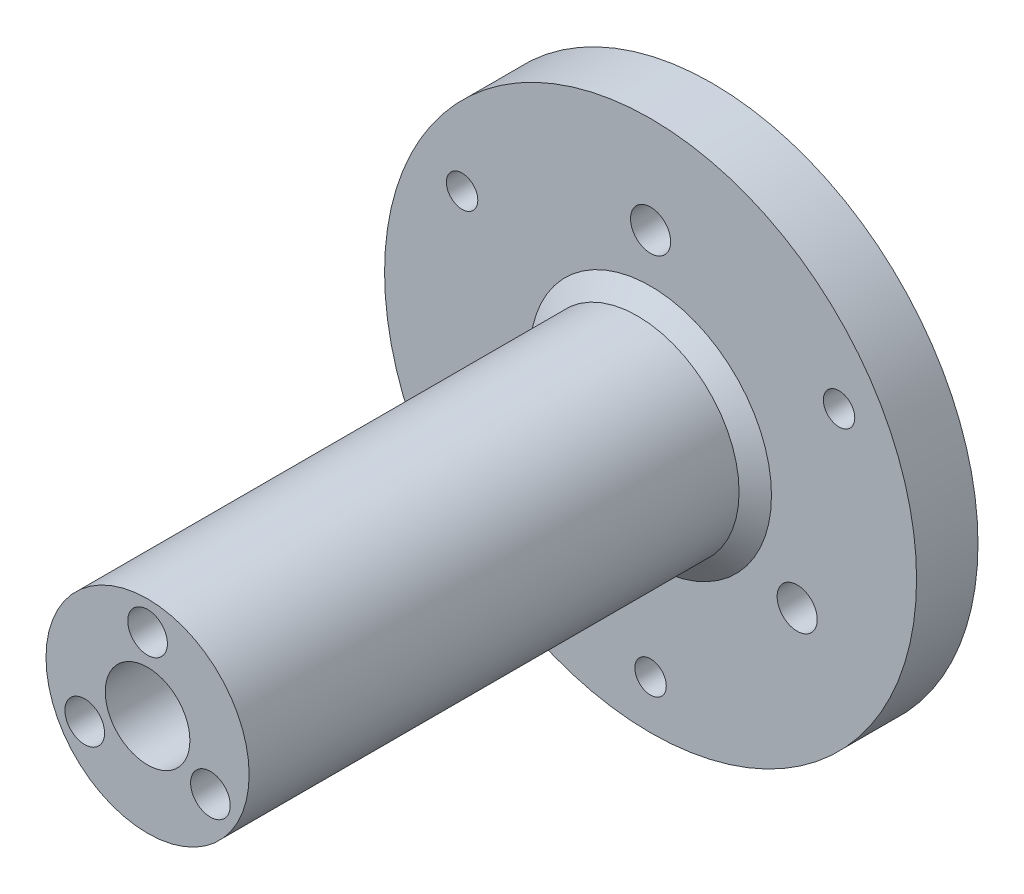
ISO-10303-21;
HEADER;
FILE_DESCRIPTION(('STEP AP214'),'2;1');
FILE_NAME('part.step','',(''),(''),'','','');
FILE_SCHEMA(('AUTOMOTIVE_DESIGN { 1 0 10303 214 1 1 1 1 }'));
ENDSEC;
DATA;
#1=APPLICATION_CONTEXT('core data for automotive mechanical design processes');
#2=APPLICATION_PROTOCOL_DEFINITION('international standard','automotive_design',2000,#1);
#3=PRODUCT_CONTEXT('',#1,'mechanical');
#4=PRODUCT('Part','Part','',(#3));
#5=PRODUCT_RELATED_PRODUCT_CATEGORY('part','',(#4));
#6=PRODUCT_DEFINITION_FORMATION('','',#4);
#7=PRODUCT_DEFINITION_CONTEXT('part definition',#1,'design');
#8=PRODUCT_DEFINITION('design','',#6,#7);
#9=PRODUCT_DEFINITION_SHAPE('','',#8);
#10=(LENGTH_UNIT() NAMED_UNIT(*) SI_UNIT(.MILLI.,.METRE.));
#11=(NAMED_UNIT(*) PLANE_ANGLE_UNIT() SI_UNIT($,.RADIAN.));
#12=(NAMED_UNIT(*) SI_UNIT($,.STERADIAN.) SOLID_ANGLE_UNIT());
#13=UNCERTAINTY_MEASURE_WITH_UNIT(LENGTH_MEASURE(1.E-05),#10,'distance_accuracy_value','');
#14=(GEOMETRIC_REPRESENTATION_CONTEXT(3) GLOBAL_UNCERTAINTY_ASSIGNED_CONTEXT((#13)) GLOBAL_UNIT_ASSIGNED_CONTEXT((#10,
#11,#12)) REPRESENTATION_CONTEXT('',''));
#15=CARTESIAN_POINT('',(0.,0.,0.));
#16=DIRECTION('',(0.,0.,1.));
#17=DIRECTION('',(1.,0.,0.));
#18=AXIS2_PLACEMENT_3D('',#15,#16,#17);
#19=CARTESIAN_POINT('',(0.,0.,6.35));
#20=DIRECTION('',(0.,0.,1.));
#21=DIRECTION('',(1.,0.,0.));
#22=AXIS2_PLACEMENT_3D('',#19,#20,#21);
#23=PLANE('',#22);
#24=CARTESIAN_POINT('',(-15.1554445662277,-8.75,6.35));
#25=DIRECTION('',(0.,0.,1.));
#26=DIRECTION('',(1.,0.,0.));
#27=AXIS2_PLACEMENT_3D('',#24,#25,#26);
#28=CIRCLE('',#27,2.075);
#29=CARTESIAN_POINT('',(-13.0804445662277,-8.75,6.35));
#30=VERTEX_POINT('',#29);
#31=EDGE_CURVE('E75',#30,#30,#28,.T.);
#32=ORIENTED_EDGE('',*,*,#31,.F.);
#33=EDGE_LOOP('',(#32));
#34=FACE_BOUND('',#33,.T.);
#35=CARTESIAN_POINT('',(15.1554445662277,-8.75,6.35));
#36=DIRECTION('',(0.,0.,1.));
#37=DIRECTION('',(1.,0.,0.));
#38=AXIS2_PLACEMENT_3D('',#35,#36,#37);
#39=CIRCLE('',#38,2.075);
#40=CARTESIAN_POINT('',(17.2304445662277,-8.75,6.35));
#41=VERTEX_POINT('',#40);
#42=EDGE_CURVE('E214',#41,#41,#39,.T.);
#43=ORIENTED_EDGE('',*,*,#42,.F.);
#44=EDGE_LOOP('',(#43));
#45=FACE_BOUND('',#44,.T.);
#46=CARTESIAN_POINT('',(0.,17.5,6.35));
#47=DIRECTION('',(0.,0.,1.));
#48=DIRECTION('',(1.,0.,0.));
#49=AXIS2_PLACEMENT_3D('',#46,#47,#48);
#50=CIRCLE('',#49,2.075);
#51=CARTESIAN_POINT('',(2.075,17.5,6.35));
#52=VERTEX_POINT('',#51);
#53=EDGE_CURVE('E217',#52,#52,#50,.T.);
#54=ORIENTED_EDGE('',*,*,#53,.F.);
#55=EDGE_LOOP('',(#54));
#56=FACE_BOUND('',#55,.T.);
#57=CARTESIAN_POINT('',(0.,0.,6.35));
#58=DIRECTION('',(0.,0.,1.));
#59=DIRECTION('',(1.,0.,0.));
#60=AXIS2_PLACEMENT_3D('',#57,#58,#59);
#61=CIRCLE('',#60,12.5);
#62=CARTESIAN_POINT('',(12.5,0.,6.35));
#63=VERTEX_POINT('',#62);
#64=EDGE_CURVE('E11',#63,#63,#61,.F.);
#65=ORIENTED_EDGE('',*,*,#64,.T.);
#66=EDGE_LOOP('',(#65));
#67=FACE_BOUND('',#66,.T.);
#68=CARTESIAN_POINT('',(0.,0.,6.35));
#69=DIRECTION('',(0.,0.,1.));
#70=DIRECTION('',(1.,0.,0.));
#71=AXIS2_PLACEMENT_3D('',#68,#69,#70);
#72=CIRCLE('',#71,27.5);
#73=CARTESIAN_POINT('',(27.5,0.,6.35));
#74=VERTEX_POINT('',#73);
#75=EDGE_CURVE('E111',#74,#74,#72,.T.);
#76=ORIENTED_EDGE('',*,*,#75,.T.);
#77=EDGE_LOOP('',(#76));
#78=FACE_BOUND('',#77,.T.);
#79=CARTESIAN_POINT('',(0.,-22.5,6.35));
#80=DIRECTION('',(0.,0.,1.));
#81=DIRECTION('',(1.,0.,0.));
#82=AXIS2_PLACEMENT_3D('',#79,#80,#81);
#83=CIRCLE('',#82,1.625);
#84=CARTESIAN_POINT('',(1.625,-22.5,6.35));
#85=VERTEX_POINT('',#84);
#86=EDGE_CURVE('E108',#85,#85,#83,.T.);
#87=ORIENTED_EDGE('',*,*,#86,.F.);
#88=EDGE_LOOP('',(#87));
#89=FACE_BOUND('',#88,.T.);
#90=CARTESIAN_POINT('',(19.4855715851499,11.25,6.35));
#91=DIRECTION('',(0.,0.,1.));
#92=DIRECTION('',(1.,0.,0.));
#93=AXIS2_PLACEMENT_3D('',#90,#91,#92);
#94=CIRCLE('',#93,1.625);
#95=CARTESIAN_POINT('',(21.1105715851499,11.25,6.35));
#96=VERTEX_POINT('',#95);
#97=EDGE_CURVE('E104',#96,#96,#94,.T.);
#98=ORIENTED_EDGE('',*,*,#97,.F.);
#99=EDGE_LOOP('',(#98));
#100=FACE_BOUND('',#99,.T.);
#101=CARTESIAN_POINT('',(-19.4855715851499,11.25,6.35));
#102=DIRECTION('',(0.,0.,1.));
#103=DIRECTION('',(1.,0.,0.));
#104=AXIS2_PLACEMENT_3D('',#101,#102,#103);
#105=CIRCLE('',#104,1.625);
#106=CARTESIAN_POINT('',(-17.8605715851499,11.25,6.35));
#107=VERTEX_POINT('',#106);
#108=EDGE_CURVE('E101',#107,#107,#105,.T.);
#109=ORIENTED_EDGE('',*,*,#108,.F.);
#110=EDGE_LOOP('',(#109));
#111=FACE_BOUND('',#110,.T.);
#112=ADVANCED_FACE('F54',(#34,#45,#56,#67,#78,#89,#100,#111),#23,.T.);
#113=CARTESIAN_POINT('',(0.,0.,6.35));
#114=DIRECTION('',(0.,0.,-1.));
#115=DIRECTION('',(-1.,0.,0.));
#116=AXIS2_PLACEMENT_3D('',#113,#114,#115);
#117=CYLINDRICAL_SURFACE('',#116,27.5);
#118=ORIENTED_EDGE('',*,*,#75,.F.);
#119=EDGE_LOOP('',(#118));
#120=FACE_BOUND('',#119,.T.);
#121=CARTESIAN_POINT('',(0.,0.,0.));
#122=DIRECTION('',(0.,0.,1.));
#123=DIRECTION('',(1.,0.,0.));
#124=AXIS2_PLACEMENT_3D('',#121,#122,#123);
#125=CIRCLE('',#124,27.5);
#126=CARTESIAN_POINT('',(27.5,0.,0.));
#127=VERTEX_POINT('',#126);
#128=EDGE_CURVE('E123',#127,#127,#125,.T.);
#129=ORIENTED_EDGE('',*,*,#128,.T.);
#130=EDGE_LOOP('',(#129));
#131=FACE_BOUND('',#130,.T.);
#132=ADVANCED_FACE('F160',(#120,#131),#117,.T.);
#133=CARTESIAN_POINT('',(0.,-22.5,6.35));
#134=DIRECTION('',(0.,0.,-1.));
#135=DIRECTION('',(-1.,0.,0.));
#136=AXIS2_PLACEMENT_3D('',#133,#134,#135);
#137=CYLINDRICAL_SURFACE('',#136,1.625);
#138=ORIENTED_EDGE('',*,*,#86,.T.);
#139=EDGE_LOOP('',(#138));
#140=FACE_BOUND('',#139,.T.);
#141=CARTESIAN_POINT('',(0.,-22.5,0.));
#142=DIRECTION('',(0.,0.,1.));
#143=DIRECTION('',(1.,0.,0.));
#144=AXIS2_PLACEMENT_3D('',#141,#142,#143);
#145=CIRCLE('',#144,1.625);
#146=CARTESIAN_POINT('',(1.625,-22.5,0.));
#147=VERTEX_POINT('',#146);
#148=EDGE_CURVE('E120',#147,#147,#145,.T.);
#149=ORIENTED_EDGE('',*,*,#148,.F.);
#150=EDGE_LOOP('',(#149));
#151=FACE_BOUND('',#150,.T.);
#152=ADVANCED_FACE('F165',(#140,#151),#137,.F.);
#153=CARTESIAN_POINT('',(19.4855715851499,11.25,6.35));
#154=DIRECTION('',(0.,0.,-1.));
#155=DIRECTION('',(-1.,0.,0.));
#156=AXIS2_PLACEMENT_3D('',#153,#154,#155);
#157=CYLINDRICAL_SURFACE('',#156,1.625);
#158=ORIENTED_EDGE('',*,*,#97,.T.);
#159=EDGE_LOOP('',(#158));
#160=FACE_BOUND('',#159,.T.);
#161=CARTESIAN_POINT('',(19.4855715851499,11.25,0.));
#162=DIRECTION('',(0.,0.,1.));
#163=DIRECTION('',(1.,0.,0.));
#164=AXIS2_PLACEMENT_3D('',#161,#162,#163);
#165=CIRCLE('',#164,1.625);
#166=CARTESIAN_POINT('',(21.1105715851499,11.25,0.));
#167=VERTEX_POINT('',#166);
#168=EDGE_CURVE('E117',#167,#167,#165,.T.);
#169=ORIENTED_EDGE('',*,*,#168,.F.);
#170=EDGE_LOOP('',(#169));
#171=FACE_BOUND('',#170,.T.);
#172=ADVANCED_FACE('F257',(#160,#171),#157,.F.);
#173=CARTESIAN_POINT('',(-19.4855715851499,11.25,6.35));
#174=DIRECTION('',(0.,0.,-1.));
#175=DIRECTION('',(-1.,0.,0.));
#176=AXIS2_PLACEMENT_3D('',#173,#174,#175);
#177=CYLINDRICAL_SURFACE('',#176,1.625);
#178=ORIENTED_EDGE('',*,*,#108,.T.);
#179=EDGE_LOOP('',(#178));
#180=FACE_BOUND('',#179,.T.);
#181=CARTESIAN_POINT('',(-19.4855715851499,11.25,0.));
#182=DIRECTION('',(0.,0.,1.));
#183=DIRECTION('',(1.,0.,0.));
#184=AXIS2_PLACEMENT_3D('',#181,#182,#183);
#185=CIRCLE('',#184,1.625);
#186=CARTESIAN_POINT('',(-17.8605715851499,11.25,0.));
#187=VERTEX_POINT('',#186);
#188=EDGE_CURVE('E100',#187,#187,#185,.T.);
#189=ORIENTED_EDGE('',*,*,#188,.F.);
#190=EDGE_LOOP('',(#189));
#191=FACE_BOUND('',#190,.T.);
#192=ADVANCED_FACE('F145',(#180,#191),#177,.F.);
#193=CARTESIAN_POINT('',(0.,0.,6.35));
#194=DIRECTION('',(0.,0.,-1.));
#195=DIRECTION('',(-1.,0.,0.));
#196=AXIS2_PLACEMENT_3D('',#193,#194,#195);
#197=CYLINDRICAL_SURFACE('',#196,7.6);
#198=CARTESIAN_POINT('',(0.,0.,45.6374079730314));
#199=DIRECTION('',(0.,0.,1.));
#200=DIRECTION('',(1.,0.,0.));
#201=AXIS2_PLACEMENT_3D('',#198,#199,#200);
#202=CIRCLE('',#201,7.6);
#203=CARTESIAN_POINT('',(-7.6,0.,45.6374079730314));
#204=VERTEX_POINT('',#203);
#205=EDGE_CURVE('E114',#204,#204,#202,.T.);
#206=ORIENTED_EDGE('',*,*,#205,.T.);
#207=EDGE_LOOP('',(#206));
#208=FACE_BOUND('',#207,.T.);
#209=CARTESIAN_POINT('',(0.,0.,0.));
#210=DIRECTION('',(0.,0.,1.));
#211=DIRECTION('',(1.,0.,0.));
#212=AXIS2_PLACEMENT_3D('',#209,#210,#211);
#213=CIRCLE('',#212,7.6);
#214=CARTESIAN_POINT('',(7.6,0.,0.));
#215=VERTEX_POINT('',#214);
#216=EDGE_CURVE('E105',#215,#215,#213,.T.);
#217=ORIENTED_EDGE('',*,*,#216,.F.);
#218=EDGE_LOOP('',(#217));
#219=FACE_BOUND('',#218,.T.);
#220=ADVANCED_FACE('F141',(#208,#219),#197,.F.);
#221=CARTESIAN_POINT('',(0.,0.,0.));
#222=DIRECTION('',(0.,0.,1.));
#223=DIRECTION('',(1.,0.,0.));
#224=AXIS2_PLACEMENT_3D('',#221,#222,#223);
#225=PLANE('',#224);
#226=CARTESIAN_POINT('',(-15.1554445662277,-8.75,0.));
#227=DIRECTION('',(0.,0.,1.));
#228=DIRECTION('',(1.,0.,0.));
#229=AXIS2_PLACEMENT_3D('',#226,#227,#228);
#230=CIRCLE('',#229,2.075);
#231=CARTESIAN_POINT('',(-13.0804445662277,-8.75,0.));
#232=VERTEX_POINT('',#231);
#233=EDGE_CURVE('E59',#232,#232,#230,.T.);
#234=ORIENTED_EDGE('',*,*,#233,.T.);
#235=EDGE_LOOP('',(#234));
#236=FACE_BOUND('',#235,.T.);
#237=CARTESIAN_POINT('',(15.1554445662277,-8.75,0.));
#238=DIRECTION('',(0.,0.,1.));
#239=DIRECTION('',(1.,0.,0.));
#240=AXIS2_PLACEMENT_3D('',#237,#238,#239);
#241=CIRCLE('',#240,2.075);
#242=CARTESIAN_POINT('',(17.2304445662277,-8.75,0.));
#243=VERTEX_POINT('',#242);
#244=EDGE_CURVE('E74',#243,#243,#241,.T.);
#245=ORIENTED_EDGE('',*,*,#244,.T.);
#246=EDGE_LOOP('',(#245));
#247=FACE_BOUND('',#246,.T.);
#248=CARTESIAN_POINT('',(0.,17.5,0.));
#249=DIRECTION('',(0.,0.,1.));
#250=DIRECTION('',(1.,0.,0.));
#251=AXIS2_PLACEMENT_3D('',#248,#249,#250);
#252=CIRCLE('',#251,2.075);
#253=CARTESIAN_POINT('',(2.075,17.5,0.));
#254=VERTEX_POINT('',#253);
#255=EDGE_CURVE('E72',#254,#254,#252,.T.);
#256=ORIENTED_EDGE('',*,*,#255,.T.);
#257=EDGE_LOOP('',(#256));
#258=FACE_BOUND('',#257,.T.);
#259=ORIENTED_EDGE('',*,*,#188,.T.);
#260=EDGE_LOOP('',(#259));
#261=FACE_BOUND('',#260,.T.);
#262=ORIENTED_EDGE('',*,*,#168,.T.);
#263=EDGE_LOOP('',(#262));
#264=FACE_BOUND('',#263,.T.);
#265=ORIENTED_EDGE('',*,*,#148,.T.);
#266=EDGE_LOOP('',(#265));
#267=FACE_BOUND('',#266,.T.);
#268=ORIENTED_EDGE('',*,*,#128,.F.);
#269=EDGE_LOOP('',(#268));
#270=FACE_BOUND('',#269,.T.);
#271=ORIENTED_EDGE('',*,*,#216,.T.);
#272=EDGE_LOOP('',(#271));
#273=FACE_BOUND('',#272,.T.);
#274=ADVANCED_FACE('F144',(#236,#247,#258,#261,#264,#267,#270,#273),#225,.F.);
#275=CARTESIAN_POINT('',(0.,0.,51.35));
#276=DIRECTION('',(0.,0.,-1.));
#277=DIRECTION('',(-1.,0.,0.));
#278=AXIS2_PLACEMENT_3D('',#275,#276,#277);
#279=CYLINDRICAL_SURFACE('',#278,10.5);
#280=CARTESIAN_POINT('',(0.,0.,7.6990170336849));
#281=DIRECTION('',(0.,0.,1.));
#282=DIRECTION('',(1.,0.,0.));
#283=AXIS2_PLACEMENT_3D('',#280,#281,#282);
#284=CIRCLE('',#283,10.5);
#285=CARTESIAN_POINT('',(-10.5,0.,7.69901703368489));
#286=VERTEX_POINT('',#285);
#287=EDGE_CURVE('E63',#286,#286,#284,.T.);
#288=CARTESIAN_POINT('',(0.,0.,58.35));
#289=DIRECTION('',(0.,0.,1.));
#290=DIRECTION('',(1.,0.,0.));
#291=AXIS2_PLACEMENT_3D('',#288,#289,#290);
#292=CIRCLE('',#291,10.5);
#293=CARTESIAN_POINT('',(-10.5,0.,58.35));
#294=VERTEX_POINT('',#293);
#295=EDGE_CURVE('E96',#294,#294,#292,.T.);
#296=CARTESIAN_POINT('',(-10.5,0.,7.69901703368489));
#297=CARTESIAN_POINT('',(-10.5,0.,8.22663143958401));
#298=CARTESIAN_POINT('',(-10.5,0.,8.75424584548312));
#299=CARTESIAN_POINT('',(-10.5,0.,9.80947465728135));
#300=CARTESIAN_POINT('',(-10.5,0.,10.3370890631805));
#301=CARTESIAN_POINT('',(-10.5,0.,11.3923178749787));
#302=CARTESIAN_POINT('',(-10.5,0.,11.9199322808778));
#303=CARTESIAN_POINT('',(-10.5,0.,12.975161092676));
#304=CARTESIAN_POINT('',(-10.5,0.,13.5027754985752));
#305=CARTESIAN_POINT('',(-10.5,0.,14.5580043103734));
#306=CARTESIAN_POINT('',(-10.5,0.,15.0856187162725));
#307=CARTESIAN_POINT('',(-10.5,0.,16.1408475280707));
#308=CARTESIAN_POINT('',(-10.5,0.,16.6684619339699));
#309=CARTESIAN_POINT('',(-10.5,0.,17.7236907457681));
#310=CARTESIAN_POINT('',(-10.5,0.,18.2513051516672));
#311=CARTESIAN_POINT('',(-10.5,0.,19.3065339634654));
#312=CARTESIAN_POINT('',(-10.5,0.,19.8341483693645));
#313=CARTESIAN_POINT('',(-10.5,0.,20.8893771811628));
#314=CARTESIAN_POINT('',(-10.5,0.,21.4169915870619));
#315=CARTESIAN_POINT('',(-10.5,0.,22.4722203988601));
#316=CARTESIAN_POINT('',(-10.5,0.,22.9998348047592));
#317=CARTESIAN_POINT('',(-10.5,0.,24.0550636165575));
#318=CARTESIAN_POINT('',(-10.5,0.,24.5826780224566));
#319=CARTESIAN_POINT('',(-10.5,0.,25.6379068342548));
#320=CARTESIAN_POINT('',(-10.5,0.,26.1655212401539));
#321=CARTESIAN_POINT('',(-10.5,0.,27.2207500519522));
#322=CARTESIAN_POINT('',(-10.5,0.,27.7483644578513));
#323=CARTESIAN_POINT('',(-10.5,0.,28.8035932696495));
#324=CARTESIAN_POINT('',(-10.5,0.,29.3312076755486));
#325=CARTESIAN_POINT('',(-10.5,0.,30.3864364873469));
#326=CARTESIAN_POINT('',(-10.5,0.,30.914050893246));
#327=CARTESIAN_POINT('',(-10.5,0.,31.9692797050442));
#328=CARTESIAN_POINT('',(-10.5,0.,32.4968941109433));
#329=CARTESIAN_POINT('',(-10.5,0.,33.5521229227416));
#330=CARTESIAN_POINT('',(-10.5,0.,34.0797373286407));
#331=CARTESIAN_POINT('',(-10.5,0.,35.1349661404389));
#332=CARTESIAN_POINT('',(-10.5,0.,35.662580546338));
#333=CARTESIAN_POINT('',(-10.5,0.,36.7178093581363));
#334=CARTESIAN_POINT('',(-10.5,0.,37.2454237640354));
#335=CARTESIAN_POINT('',(-10.5,0.,38.3006525758336));
#336=CARTESIAN_POINT('',(-10.5,0.,38.8282669817327));
#337=CARTESIAN_POINT('',(-10.5,0.,39.8834957935309));
#338=CARTESIAN_POINT('',(-10.5,0.,40.4111101994301));
#339=CARTESIAN_POINT('',(-10.5,0.,41.4663390112283));
#340=CARTESIAN_POINT('',(-10.5,0.,41.9939534171274));
#341=CARTESIAN_POINT('',(-10.5,0.,43.0491822289256));
#342=CARTESIAN_POINT('',(-10.5,0.,43.5767966348248));
#343=CARTESIAN_POINT('',(-10.5,0.,44.632025446623));
#344=CARTESIAN_POINT('',(-10.5,0.,45.1596398525221));
#345=CARTESIAN_POINT('',(-10.5,0.,46.2148686643203));
#346=CARTESIAN_POINT('',(-10.5,0.,46.7424830702194));
#347=CARTESIAN_POINT('',(-10.5,0.,47.7977118820177));
#348=CARTESIAN_POINT('',(-10.5,0.,48.3253262879168));
#349=CARTESIAN_POINT('',(-10.5,0.,49.380555099715));
#350=CARTESIAN_POINT('',(-10.5,0.,49.9081695056141));
#351=CARTESIAN_POINT('',(-10.5,0.,50.9633983174124));
#352=CARTESIAN_POINT('',(-10.5,0.,51.4910127233115));
#353=CARTESIAN_POINT('',(-10.5,0.,52.5462415351097));
#354=CARTESIAN_POINT('',(-10.5,0.,53.0738559410088));
#355=CARTESIAN_POINT('',(-10.5,0.,54.1290847528071));
#356=CARTESIAN_POINT('',(-10.5,0.,54.6566991587062));
#357=CARTESIAN_POINT('',(-10.5,0.,55.7119279705044));
#358=CARTESIAN_POINT('',(-10.5,0.,56.2395423764035));
#359=CARTESIAN_POINT('',(-10.5,0.,57.2947711882018));
#360=CARTESIAN_POINT('',(-10.5,0.,57.8223855941009));
#361=CARTESIAN_POINT('',(-10.5,0.,58.35));
#362=B_SPLINE_CURVE_WITH_KNOTS('',3,(#296,#297,#298,#299,#300,#301,#302,#303,#304,#305,#306,
#307,#308,#309,#310,#311,#312,#313,#314,#315,#316,#317,#318,#319,#320,#321,#322,#323,#324,#325,
#326,#327,#328,#329,#330,#331,#332,#333,#334,#335,#336,#337,#338,#339,#340,#341,#342,#343,#344,
#345,#346,#347,#348,#349,#350,#351,#352,#353,#354,#355,#356,#357,#358,#359,#360,#361),
.UNSPECIFIED.,.F.,.F.,(4,2,2,2,2,2,2,2,2,2,2,2,2,2,2,2,2,2,2,2,2,2,2,2,2,2,2,2,2,2,2,2,4),(0.,
1.58284321769735,3.16568643539469,4.74852965309204,6.33137287078939,7.91421608848673,
9.49705930618408,11.0799025238814,12.6627457415788,14.2455889592761,15.8284321769735,
17.4112753946708,18.9941186123682,20.5769618300655,22.1598050477629,23.7426482654602,
25.3254914831575,26.9083347008549,28.4911779185522,30.0740211362496,31.6568643539469,
33.2397075716443,34.8225507893416,36.405394007039,37.9882372247363,39.5710804424337,
41.153923660131,42.7367668778284,44.3196100955257,45.9024533132231,47.4852965309204,
49.0681397486178,50.6509829663151),.UNSPECIFIED.);
#363=EDGE_CURVE('BSEAM150',#286,#294,#362,.T.);
#364=ORIENTED_EDGE('',*,*,#287,.T.);
#365=ORIENTED_EDGE('',*,*,#295,.F.);
#366=ORIENTED_EDGE('',*,*,#363,.T.);
#367=ORIENTED_EDGE('',*,*,#363,.F.);
#368=EDGE_LOOP('',(#364,#366,#365,#367));
#369=FACE_BOUND('',#368,.T.);
#370=ADVANCED_FACE('F150',(#369),#279,.T.);
#371=CARTESIAN_POINT('',(0.,0.,58.35));
#372=DIRECTION('',(0.,0.,1.));
#373=DIRECTION('',(1.,0.,0.));
#374=AXIS2_PLACEMENT_3D('',#371,#372,#373);
#375=PLANE('',#374);
#376=CARTESIAN_POINT('',(0.,7.5,58.35));
#377=DIRECTION('',(0.,0.,1.));
#378=DIRECTION('',(1.,0.,0.));
#379=AXIS2_PLACEMENT_3D('',#376,#377,#378);
#380=CIRCLE('',#379,2.05);
#381=CARTESIAN_POINT('',(2.05,7.5,58.35));
#382=VERTEX_POINT('',#381);
#383=EDGE_CURVE('E224',#382,#382,#380,.T.);
#384=ORIENTED_EDGE('',*,*,#383,.F.);
#385=EDGE_LOOP('',(#384));
#386=FACE_BOUND('',#385,.T.);
#387=CARTESIAN_POINT('',(-6.49519052838329,-3.75,58.35));
#388=DIRECTION('',(0.,0.,1.));
#389=DIRECTION('',(1.,0.,0.));
#390=AXIS2_PLACEMENT_3D('',#387,#388,#389);
#391=CIRCLE('',#390,2.05);
#392=CARTESIAN_POINT('',(-4.44519052838329,-3.75,58.35));
#393=VERTEX_POINT('',#392);
#394=EDGE_CURVE('E89',#393,#393,#391,.T.);
#395=ORIENTED_EDGE('',*,*,#394,.F.);
#396=EDGE_LOOP('',(#395));
#397=FACE_BOUND('',#396,.T.);
#398=CARTESIAN_POINT('',(6.49519052838329,-3.75,58.35));
#399=DIRECTION('',(0.,0.,1.));
#400=DIRECTION('',(1.,0.,0.));
#401=AXIS2_PLACEMENT_3D('',#398,#399,#400);
#402=CIRCLE('',#401,2.05);
#403=CARTESIAN_POINT('',(8.54519052838329,-3.75,58.35));
#404=VERTEX_POINT('',#403);
#405=EDGE_CURVE('E80',#404,#404,#402,.T.);
#406=ORIENTED_EDGE('',*,*,#405,.F.);
#407=EDGE_LOOP('',(#406));
#408=FACE_BOUND('',#407,.T.);
#409=ORIENTED_EDGE('',*,*,#295,.T.);
#410=EDGE_LOOP('',(#409));
#411=FACE_BOUND('',#410,.T.);
#412=CARTESIAN_POINT('',(0.,0.,58.35));
#413=DIRECTION('',(0.,0.,1.));
#414=DIRECTION('',(1.,0.,0.));
#415=AXIS2_PLACEMENT_3D('',#412,#413,#414);
#416=CIRCLE('',#415,4.375);
#417=CARTESIAN_POINT('',(4.375,0.,58.35));
#418=VERTEX_POINT('',#417);
#419=EDGE_CURVE('E93',#418,#418,#416,.T.);
#420=ORIENTED_EDGE('',*,*,#419,.F.);
#421=EDGE_LOOP('',(#420));
#422=FACE_BOUND('',#421,.T.);
#423=ADVANCED_FACE('F155',(#386,#397,#408,#411,#422),#375,.T.);
#424=CARTESIAN_POINT('',(0.,0.,58.35));
#425=DIRECTION('',(0.,0.,-1.));
#426=DIRECTION('',(-1.,0.,0.));
#427=AXIS2_PLACEMENT_3D('',#424,#425,#426);
#428=CYLINDRICAL_SURFACE('',#427,4.375);
#429=CARTESIAN_POINT('',(0.,0.,50.2431852947748));
#430=DIRECTION('',(0.,0.,-1.));
#431=DIRECTION('',(-1.,0.,0.));
#432=AXIS2_PLACEMENT_3D('',#429,#430,#431);
#433=CIRCLE('',#432,4.375);
#434=CARTESIAN_POINT('',(-4.375,0.,50.2431852947748));
#435=VERTEX_POINT('',#434);
#436=EDGE_CURVE('E68',#435,#435,#433,.T.);
#437=ORIENTED_EDGE('',*,*,#436,.T.);
#438=EDGE_LOOP('',(#437));
#439=FACE_BOUND('',#438,.T.);
#440=ORIENTED_EDGE('',*,*,#419,.T.);
#441=EDGE_LOOP('',(#440));
#442=FACE_BOUND('',#441,.T.);
#443=ADVANCED_FACE('F132',(#439,#442),#428,.F.);
#444=CARTESIAN_POINT('',(6.49519052838329,-3.75,52.35));
#445=DIRECTION('',(0.,0.,1.));
#446=DIRECTION('',(1.,0.,0.));
#447=AXIS2_PLACEMENT_3D('',#444,#445,#446);
#448=CYLINDRICAL_SURFACE('',#447,2.05);
#449=CARTESIAN_POINT('',(6.49519052838329,-3.75,52.35));
#450=DIRECTION('',(0.,0.,1.));
#451=DIRECTION('',(1.,0.,0.));
#452=AXIS2_PLACEMENT_3D('',#449,#450,#451);
#453=CIRCLE('',#452,2.05);
#454=CARTESIAN_POINT('',(8.54519052838329,-3.75,52.35));
#455=VERTEX_POINT('',#454);
#456=EDGE_CURVE('E84',#455,#455,#453,.T.);
#457=ORIENTED_EDGE('',*,*,#456,.F.);
#458=EDGE_LOOP('',(#457));
#459=FACE_BOUND('',#458,.T.);
#460=ORIENTED_EDGE('',*,*,#405,.T.);
#461=EDGE_LOOP('',(#460));
#462=FACE_BOUND('',#461,.T.);
#463=ADVANCED_FACE('F176',(#459,#462),#448,.F.);
#464=CARTESIAN_POINT('',(0.,0.,52.35));
#465=DIRECTION('',(0.,0.,1.));
#466=DIRECTION('',(1.,0.,0.));
#467=AXIS2_PLACEMENT_3D('',#464,#465,#466);
#468=PLANE('',#467);
#469=ORIENTED_EDGE('',*,*,#456,.T.);
#470=EDGE_LOOP('',(#469));
#471=FACE_BOUND('',#470,.T.);
#472=ADVANCED_FACE('F179',(#471),#468,.T.);
#473=CARTESIAN_POINT('',(-6.49519052838329,-3.75,52.35));
#474=DIRECTION('',(0.,0.,1.));
#475=DIRECTION('',(1.,0.,0.));
#476=AXIS2_PLACEMENT_3D('',#473,#474,#475);
#477=CYLINDRICAL_SURFACE('',#476,2.05);
#478=CARTESIAN_POINT('',(-6.49519052838329,-3.75,52.35));
#479=DIRECTION('',(0.,0.,1.));
#480=DIRECTION('',(1.,0.,0.));
#481=AXIS2_PLACEMENT_3D('',#478,#479,#480);
#482=CIRCLE('',#481,2.05);
#483=CARTESIAN_POINT('',(-4.44519052838329,-3.75,52.35));
#484=VERTEX_POINT('',#483);
#485=EDGE_CURVE('E227',#484,#484,#482,.T.);
#486=ORIENTED_EDGE('',*,*,#485,.F.);
#487=EDGE_LOOP('',(#486));
#488=FACE_BOUND('',#487,.T.);
#489=ORIENTED_EDGE('',*,*,#394,.T.);
#490=EDGE_LOOP('',(#489));
#491=FACE_BOUND('',#490,.T.);
#492=ADVANCED_FACE('F183',(#488,#491),#477,.F.);
#493=CARTESIAN_POINT('',(0.,0.,52.35));
#494=DIRECTION('',(0.,0.,1.));
#495=DIRECTION('',(1.,0.,0.));
#496=AXIS2_PLACEMENT_3D('',#493,#494,#495);
#497=PLANE('',#496);
#498=ORIENTED_EDGE('',*,*,#485,.T.);
#499=EDGE_LOOP('',(#498));
#500=FACE_BOUND('',#499,.T.);
#501=ADVANCED_FACE('F187',(#500),#497,.T.);
#502=CARTESIAN_POINT('',(0.,7.5,52.35));
#503=DIRECTION('',(0.,0.,1.));
#504=DIRECTION('',(1.,0.,0.));
#505=AXIS2_PLACEMENT_3D('',#502,#503,#504);
#506=CYLINDRICAL_SURFACE('',#505,2.05);
#507=CARTESIAN_POINT('',(0.,7.5,52.35));
#508=DIRECTION('',(0.,0.,1.));
#509=DIRECTION('',(1.,0.,0.));
#510=AXIS2_PLACEMENT_3D('',#507,#508,#509);
#511=CIRCLE('',#510,2.05);
#512=CARTESIAN_POINT('',(2.05,7.5,52.35));
#513=VERTEX_POINT('',#512);
#514=EDGE_CURVE('E97',#513,#513,#511,.T.);
#515=ORIENTED_EDGE('',*,*,#514,.F.);
#516=EDGE_LOOP('',(#515));
#517=FACE_BOUND('',#516,.T.);
#518=ORIENTED_EDGE('',*,*,#383,.T.);
#519=EDGE_LOOP('',(#518));
#520=FACE_BOUND('',#519,.T.);
#521=ADVANCED_FACE('F191',(#517,#520),#506,.F.);
#522=CARTESIAN_POINT('',(0.,0.,52.35));
#523=DIRECTION('',(0.,0.,1.));
#524=DIRECTION('',(1.,0.,0.));
#525=AXIS2_PLACEMENT_3D('',#522,#523,#524);
#526=PLANE('',#525);
#527=ORIENTED_EDGE('',*,*,#514,.T.);
#528=EDGE_LOOP('',(#527));
#529=FACE_BOUND('',#528,.T.);
#530=ADVANCED_FACE('F138',(#529),#526,.T.);
#531=CARTESIAN_POINT('',(0.,0.,45.6374079730314));
#532=DIRECTION('',(0.,0.,-1.));
#533=DIRECTION('',(-1.,0.,0.));
#534=AXIS2_PLACEMENT_3D('',#531,#532,#533);
#535=CONICAL_SURFACE('',#534,7.6,0.610865238198011);
#536=CARTESIAN_POINT('',(-4.375,0.,50.2431852947748));
#537=CARTESIAN_POINT('',(-4.40859375,0.,50.1952084476733));
#538=CARTESIAN_POINT('',(-4.4421875,0.,50.1472316005718));
#539=CARTESIAN_POINT('',(-4.509375,0.,50.0512779063688));
#540=CARTESIAN_POINT('',(-4.54296875,0.,50.0033010592673));
#541=CARTESIAN_POINT('',(-4.61015625,0.,49.9073473650643));
#542=CARTESIAN_POINT('',(-4.64375,0.,49.8593705179628));
#543=CARTESIAN_POINT('',(-4.7109375,0.,49.7634168237599));
#544=CARTESIAN_POINT('',(-4.74453125,0.,49.7154399766584));
#545=CARTESIAN_POINT('',(-4.81171875,0.,49.6194862824554));
#546=CARTESIAN_POINT('',(-4.8453125,0.,49.5715094353539));
#547=CARTESIAN_POINT('',(-4.9125,0.,49.4755557411509));
#548=CARTESIAN_POINT('',(-4.94609375,0.,49.4275788940494));
#549=CARTESIAN_POINT('',(-5.01328125,0.,49.3316251998464));
#550=CARTESIAN_POINT('',(-5.046875,0.,49.2836483527449));
#551=CARTESIAN_POINT('',(-5.1140625,0.,49.1876946585419));
#552=CARTESIAN_POINT('',(-5.14765625,0.,49.1397178114404));
#553=CARTESIAN_POINT('',(-5.21484375,0.,49.0437641172375));
#554=CARTESIAN_POINT('',(-5.2484375,0.,48.995787270136));
#555=CARTESIAN_POINT('',(-5.315625,0.,48.899833575933));
#556=CARTESIAN_POINT('',(-5.34921875,0.,48.8518567288315));
#557=CARTESIAN_POINT('',(-5.41640625,0.,48.7559030346285));
#558=CARTESIAN_POINT('',(-5.45,0.,48.707926187527));
#559=CARTESIAN_POINT('',(-5.5171875,0.,48.611972493324));
#560=CARTESIAN_POINT('',(-5.55078125,0.,48.5639956462225));
#561=CARTESIAN_POINT('',(-5.61796875,0.,48.4680419520195));
#562=CARTESIAN_POINT('',(-5.6515625,0.,48.420065104918));
#563=CARTESIAN_POINT('',(-5.71875,0.,48.3241114107151));
#564=CARTESIAN_POINT('',(-5.75234375,0.,48.2761345636136));
#565=CARTESIAN_POINT('',(-5.81953125,0.,48.1801808694106));
#566=CARTESIAN_POINT('',(-5.853125,0.,48.1322040223091));
#567=CARTESIAN_POINT('',(-5.9203125,0.,48.0362503281061));
#568=CARTESIAN_POINT('',(-5.95390625,0.,47.9882734810046));
#569=CARTESIAN_POINT('',(-6.02109375,0.,47.8923197868016));
#570=CARTESIAN_POINT('',(-6.0546875,0.,47.8443429397001));
#571=CARTESIAN_POINT('',(-6.121875,0.,47.7483892454971));
#572=CARTESIAN_POINT('',(-6.15546875,0.,47.7004123983956));
#573=CARTESIAN_POINT('',(-6.22265625,0.,47.6044587041927));
#574=CARTESIAN_POINT('',(-6.25625,0.,47.5564818570912));
#575=CARTESIAN_POINT('',(-6.3234375,0.,47.4605281628882));
#576=CARTESIAN_POINT('',(-6.35703125,0.,47.4125513157867));
#577=CARTESIAN_POINT('',(-6.42421875,0.,47.3165976215837));
#578=CARTESIAN_POINT('',(-6.4578125,0.,47.2686207744822));
#579=CARTESIAN_POINT('',(-6.525,0.,47.1726670802792));
#580=CARTESIAN_POINT('',(-6.55859375,0.,47.1246902331777));
#581=CARTESIAN_POINT('',(-6.62578125,0.,47.0287365389747));
#582=CARTESIAN_POINT('',(-6.659375,0.,46.9807596918732));
#583=CARTESIAN_POINT('',(-6.7265625,0.,46.8848059976703));
#584=CARTESIAN_POINT('',(-6.76015625,0.,46.8368291505688));
#585=CARTESIAN_POINT('',(-6.82734375,0.,46.7408754563658));
#586=CARTESIAN_POINT('',(-6.8609375,0.,46.6928986092643));
#587=CARTESIAN_POINT('',(-6.928125,0.,46.5969449150613));
#588=CARTESIAN_POINT('',(-6.96171875,0.,46.5489680679598));
#589=CARTESIAN_POINT('',(-7.02890625,0.,46.4530143737568));
#590=CARTESIAN_POINT('',(-7.0625,0.,46.4050375266553));
#591=CARTESIAN_POINT('',(-7.1296875,0.,46.3090838324523));
#592=CARTESIAN_POINT('',(-7.16328125,0.,46.2611069853508));
#593=CARTESIAN_POINT('',(-7.23046875,0.,46.1651532911479));
#594=CARTESIAN_POINT('',(-7.2640625,0.,46.1171764440464));
#595=CARTESIAN_POINT('',(-7.33125,0.,46.0212227498434));
#596=CARTESIAN_POINT('',(-7.36484375,0.,45.9732459027419));
#597=CARTESIAN_POINT('',(-7.43203125,0.,45.8772922085389));
#598=CARTESIAN_POINT('',(-7.465625,0.,45.8293153614374));
#599=CARTESIAN_POINT('',(-7.5328125,0.,45.7333616672344));
#600=CARTESIAN_POINT('',(-7.56640625,0.,45.6853848201329));
#601=CARTESIAN_POINT('',(-7.6,0.,45.6374079730314));
#602=B_SPLINE_CURVE_WITH_KNOTS('',3,(#536,#537,#538,#539,#540,#541,#542,#543,#544,#545,#546,
#547,#548,#549,#550,#551,#552,#553,#554,#555,#556,#557,#558,#559,#560,#561,#562,#563,#564,#565,
#566,#567,#568,#569,#570,#571,#572,#573,#574,#575,#576,#577,#578,#579,#580,#581,#582,#583,#584,
#585,#586,#587,#588,#589,#590,#591,#592,#593,#594,#595,#596,#597,#598,#599,#600,#601),
.UNSPECIFIED.,.F.,.F.,(4,2,2,2,2,2,2,2,2,2,2,2,2,2,2,2,2,2,2,2,2,2,2,2,2,2,2,2,2,2,2,2,4),(0.,
0.175706747371191,0.351413494742375,0.527120242113566,0.702826989484756,0.878533736855947,
1.05424048422714,1.22994723159833,1.40565397896952,1.58136072634071,1.7570674737119,
1.93277422108309,2.10848096845428,2.28418771582547,2.45989446319666,2.63560121056785,
2.81130795793904,2.98701470531023,3.16272145268142,3.33842820005261,3.5141349474238,
3.68984169479499,3.86554844216617,4.04125518953737,4.21696193690856,4.39266868427975,
4.56837543165094,4.74408217902213,4.91978892639332,5.09549567376451,5.2712024211357,
5.44690916850689,5.62261591587807),.UNSPECIFIED.);
#603=EDGE_CURVE('BSEAM135',#435,#204,#602,.T.);
#604=ORIENTED_EDGE('',*,*,#436,.F.);
#605=ORIENTED_EDGE('',*,*,#205,.F.);
#606=ORIENTED_EDGE('',*,*,#603,.T.);
#607=ORIENTED_EDGE('',*,*,#603,.F.);
#608=EDGE_LOOP('',(#604,#606,#605,#607));
#609=FACE_BOUND('',#608,.T.);
#610=ADVANCED_FACE('F135',(#609),#535,.F.);
#611=CARTESIAN_POINT('',(0.,0.,7.6990170336849));
#612=DIRECTION('',(0.,0.,-1.));
#613=DIRECTION('',(-1.,0.,0.));
#614=AXIS2_PLACEMENT_3D('',#611,#612,#613);
#615=CONICAL_SURFACE('',#614,10.5,0.977384381116815);
#616=ORIENTED_EDGE('',*,*,#64,.F.);
#617=EDGE_LOOP('',(#616));
#618=FACE_BOUND('',#617,.T.);
#619=ORIENTED_EDGE('',*,*,#287,.F.);
#620=EDGE_LOOP('',(#619));
#621=FACE_BOUND('',#620,.T.);
#622=ADVANCED_FACE('F57',(#618,#621),#615,.T.);
#623=CARTESIAN_POINT('',(0.,17.5,-1.65));
#624=DIRECTION('',(0.,0.,1.));
#625=DIRECTION('',(1.,0.,0.));
#626=AXIS2_PLACEMENT_3D('',#623,#624,#625);
#627=CYLINDRICAL_SURFACE('',#626,2.075);
#628=ORIENTED_EDGE('',*,*,#53,.T.);
#629=EDGE_LOOP('',(#628));
#630=FACE_BOUND('',#629,.T.);
#631=ORIENTED_EDGE('',*,*,#255,.F.);
#632=EDGE_LOOP('',(#631));
#633=FACE_BOUND('',#632,.T.);
#634=ADVANCED_FACE('F199',(#630,#633),#627,.F.);
#635=CARTESIAN_POINT('',(15.1554445662277,-8.75,-1.65));
#636=DIRECTION('',(0.,0.,1.));
#637=DIRECTION('',(1.,0.,0.));
#638=AXIS2_PLACEMENT_3D('',#635,#636,#637);
#639=CYLINDRICAL_SURFACE('',#638,2.075);
#640=ORIENTED_EDGE('',*,*,#42,.T.);
#641=EDGE_LOOP('',(#640));
#642=FACE_BOUND('',#641,.T.);
#643=ORIENTED_EDGE('',*,*,#244,.F.);
#644=EDGE_LOOP('',(#643));
#645=FACE_BOUND('',#644,.T.);
#646=ADVANCED_FACE('F202',(#642,#645),#639,.F.);
#647=CARTESIAN_POINT('',(-15.1554445662277,-8.75,-1.65));
#648=DIRECTION('',(0.,0.,1.));
#649=DIRECTION('',(1.,0.,0.));
#650=AXIS2_PLACEMENT_3D('',#647,#648,#649);
#651=CYLINDRICAL_SURFACE('',#650,2.075);
#652=ORIENTED_EDGE('',*,*,#31,.T.);
#653=EDGE_LOOP('',(#652));
#654=FACE_BOUND('',#653,.T.);
#655=ORIENTED_EDGE('',*,*,#233,.F.);
#656=EDGE_LOOP('',(#655));
#657=FACE_BOUND('',#656,.T.);
#658=ADVANCED_FACE('F206',(#654,#657),#651,.F.);
#659=CLOSED_SHELL('',(#112,#132,#152,#172,#192,#220,#274,#370,#423,#443,#463,#472,#492,#501,
#521,#530,#610,#622,#634,#646,#658));
#660=MANIFOLD_SOLID_BREP('B2',#659);
#661=ADVANCED_BREP_SHAPE_REPRESENTATION('',(#18,#660),#14);
#662=SHAPE_DEFINITION_REPRESENTATION(#9,#661);
ENDSEC;
END-ISO-10303-21;
